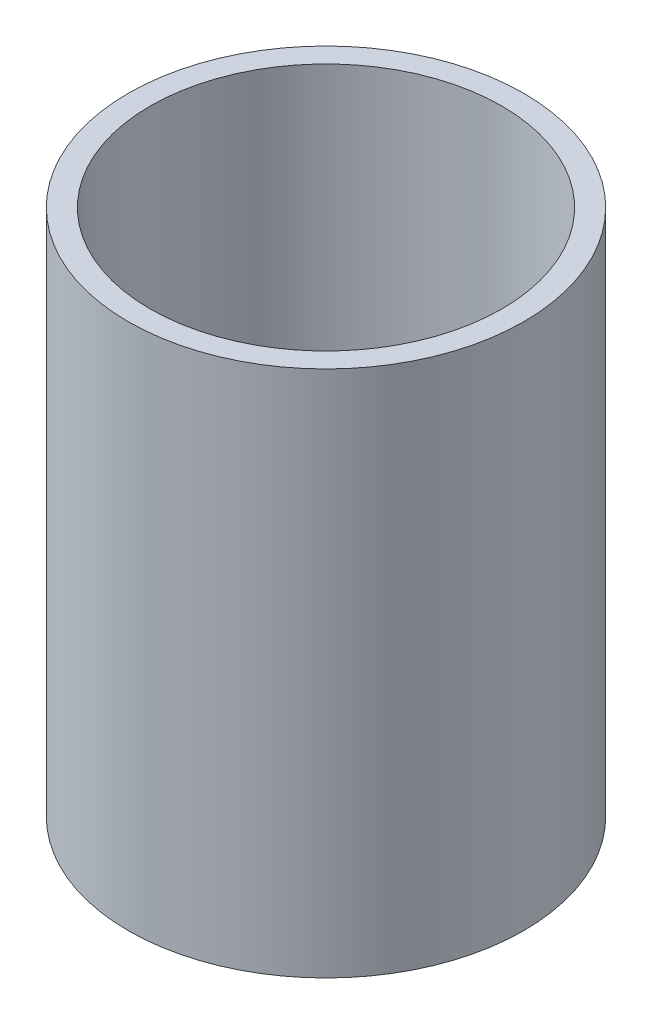
ISO-10303-21;
HEADER;
FILE_DESCRIPTION(('STEP AP214'),'2;1');
FILE_NAME('part.step','',(''),(''),'','','');
FILE_SCHEMA(('AUTOMOTIVE_DESIGN { 1 0 10303 214 1 1 1 1 }'));
ENDSEC;
DATA;
#1=APPLICATION_CONTEXT('core data for automotive mechanical design processes');
#2=APPLICATION_PROTOCOL_DEFINITION('international standard','automotive_design',2000,#1);
#3=PRODUCT_CONTEXT('',#1,'mechanical');
#4=PRODUCT('Part','Part','',(#3));
#5=PRODUCT_RELATED_PRODUCT_CATEGORY('part','',(#4));
#6=PRODUCT_DEFINITION_FORMATION('','',#4);
#7=PRODUCT_DEFINITION_CONTEXT('part definition',#1,'design');
#8=PRODUCT_DEFINITION('design','',#6,#7);
#9=PRODUCT_DEFINITION_SHAPE('','',#8);
#10=(LENGTH_UNIT() NAMED_UNIT(*) SI_UNIT(.MILLI.,.METRE.));
#11=(NAMED_UNIT(*) PLANE_ANGLE_UNIT() SI_UNIT($,.RADIAN.));
#12=(NAMED_UNIT(*) SI_UNIT($,.STERADIAN.) SOLID_ANGLE_UNIT());
#13=UNCERTAINTY_MEASURE_WITH_UNIT(LENGTH_MEASURE(1.E-05),#10,'distance_accuracy_value','');
#14=(GEOMETRIC_REPRESENTATION_CONTEXT(3) GLOBAL_UNCERTAINTY_ASSIGNED_CONTEXT((#13)) GLOBAL_UNIT_ASSIGNED_CONTEXT((#10,
#11,#12)) REPRESENTATION_CONTEXT('',''));
#15=CARTESIAN_POINT('',(0.,0.,0.));
#16=DIRECTION('',(0.,0.,1.));
#17=DIRECTION('',(1.,0.,0.));
#18=AXIS2_PLACEMENT_3D('',#15,#16,#17);
#19=CARTESIAN_POINT('',(0.,38.1,0.));
#20=DIRECTION('',(0.,1.,0.));
#21=DIRECTION('',(0.,0.,1.));
#22=AXIS2_PLACEMENT_3D('',#19,#20,#21);
#23=PLANE('',#22);
#24=CARTESIAN_POINT('',(0.,38.1,0.));
#25=DIRECTION('',(0.,1.,0.));
#26=DIRECTION('',(0.,0.,1.));
#27=AXIS2_PLACEMENT_3D('',#24,#25,#26);
#28=CIRCLE('',#27,28.575);
#29=CARTESIAN_POINT('',(0.,38.1,28.575));
#30=VERTEX_POINT('',#29);
#31=EDGE_CURVE('E10',#30,#30,#28,.T.);
#32=ORIENTED_EDGE('',*,*,#31,.T.);
#33=EDGE_LOOP('',(#32));
#34=FACE_BOUND('',#33,.T.);
#35=CARTESIAN_POINT('',(0.,38.1,0.));
#36=DIRECTION('',(0.,1.,0.));
#37=DIRECTION('',(0.,0.,1.));
#38=AXIS2_PLACEMENT_3D('',#35,#36,#37);
#39=CIRCLE('',#38,25.4);
#40=CARTESIAN_POINT('',(0.,38.1,25.4));
#41=VERTEX_POINT('',#40);
#42=EDGE_CURVE('E42',#41,#41,#39,.T.);
#43=ORIENTED_EDGE('',*,*,#42,.F.);
#44=EDGE_LOOP('',(#43));
#45=FACE_BOUND('',#44,.T.);
#46=ADVANCED_FACE('F31',(#34,#45),#23,.T.);
#47=CARTESIAN_POINT('',(0.,-38.1,0.));
#48=DIRECTION('',(0.,1.,0.));
#49=DIRECTION('',(0.,0.,1.));
#50=AXIS2_PLACEMENT_3D('',#47,#48,#49);
#51=PLANE('',#50);
#52=CARTESIAN_POINT('',(0.,-38.1,0.));
#53=DIRECTION('',(0.,1.,0.));
#54=DIRECTION('',(0.,0.,1.));
#55=AXIS2_PLACEMENT_3D('',#52,#53,#54);
#56=CIRCLE('',#55,28.575);
#57=CARTESIAN_POINT('',(0.,-38.1,28.575));
#58=VERTEX_POINT('',#57);
#59=EDGE_CURVE('E35',#58,#58,#56,.T.);
#60=ORIENTED_EDGE('',*,*,#59,.F.);
#61=EDGE_LOOP('',(#60));
#62=FACE_BOUND('',#61,.T.);
#63=CARTESIAN_POINT('',(0.,-38.1,0.));
#64=DIRECTION('',(0.,1.,0.));
#65=DIRECTION('',(0.,0.,1.));
#66=AXIS2_PLACEMENT_3D('',#63,#64,#65);
#67=CIRCLE('',#66,25.4);
#68=CARTESIAN_POINT('',(0.,-38.1,25.4));
#69=VERTEX_POINT('',#68);
#70=EDGE_CURVE('E44',#69,#69,#67,.T.);
#71=ORIENTED_EDGE('',*,*,#70,.T.);
#72=EDGE_LOOP('',(#71));
#73=FACE_BOUND('',#72,.T.);
#74=ADVANCED_FACE('F54',(#62,#73),#51,.F.);
#75=CARTESIAN_POINT('',(0.,38.1,0.));
#76=DIRECTION('',(0.,-1.,0.));
#77=DIRECTION('',(0.,0.,-1.));
#78=AXIS2_PLACEMENT_3D('',#75,#76,#77);
#79=CYLINDRICAL_SURFACE('',#78,28.575);
#80=ORIENTED_EDGE('',*,*,#31,.F.);
#81=EDGE_LOOP('',(#80));
#82=FACE_BOUND('',#81,.T.);
#83=ORIENTED_EDGE('',*,*,#59,.T.);
#84=EDGE_LOOP('',(#83));
#85=FACE_BOUND('',#84,.T.);
#86=ADVANCED_FACE('F33',(#82,#85),#79,.T.);
#87=CARTESIAN_POINT('',(0.,38.1,0.));
#88=DIRECTION('',(0.,-1.,0.));
#89=DIRECTION('',(0.,0.,-1.));
#90=AXIS2_PLACEMENT_3D('',#87,#88,#89);
#91=CYLINDRICAL_SURFACE('',#90,25.4);
#92=ORIENTED_EDGE('',*,*,#42,.T.);
#93=EDGE_LOOP('',(#92));
#94=FACE_BOUND('',#93,.T.);
#95=ORIENTED_EDGE('',*,*,#70,.F.);
#96=EDGE_LOOP('',(#95));
#97=FACE_BOUND('',#96,.T.);
#98=ADVANCED_FACE('F50',(#94,#97),#91,.F.);
#99=CLOSED_SHELL('',(#46,#74,#86,#98));
#100=MANIFOLD_SOLID_BREP('B2',#99);
#101=ADVANCED_BREP_SHAPE_REPRESENTATION('',(#18,#100),#14);
#102=SHAPE_DEFINITION_REPRESENTATION(#9,#101);
ENDSEC;
END-ISO-10303-21;
